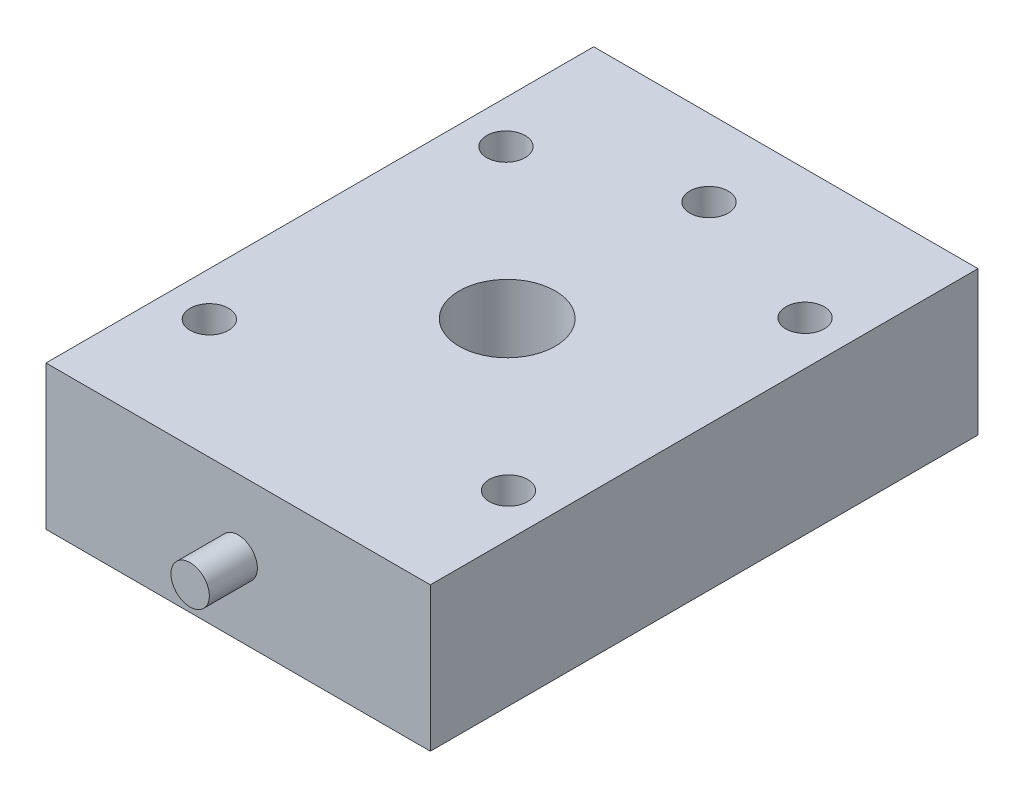
ISO-10303-21;
HEADER;
FILE_DESCRIPTION(('STEP AP214'),'2;1');
FILE_NAME('part.step','',(''),(''),'','','');
FILE_SCHEMA(('AUTOMOTIVE_DESIGN { 1 0 10303 214 1 1 1 1 }'));
ENDSEC;
DATA;
#1=APPLICATION_CONTEXT('core data for automotive mechanical design processes');
#2=APPLICATION_PROTOCOL_DEFINITION('international standard','automotive_design',2000,#1);
#3=PRODUCT_CONTEXT('',#1,'mechanical');
#4=PRODUCT('Part','Part','',(#3));
#5=PRODUCT_RELATED_PRODUCT_CATEGORY('part','',(#4));
#6=PRODUCT_DEFINITION_FORMATION('','',#4);
#7=PRODUCT_DEFINITION_CONTEXT('part definition',#1,'design');
#8=PRODUCT_DEFINITION('design','',#6,#7);
#9=PRODUCT_DEFINITION_SHAPE('','',#8);
#10=(LENGTH_UNIT() NAMED_UNIT(*) SI_UNIT(.MILLI.,.METRE.));
#11=(NAMED_UNIT(*) PLANE_ANGLE_UNIT() SI_UNIT($,.RADIAN.));
#12=(NAMED_UNIT(*) SI_UNIT($,.STERADIAN.) SOLID_ANGLE_UNIT());
#13=UNCERTAINTY_MEASURE_WITH_UNIT(LENGTH_MEASURE(1.E-05),#10,'distance_accuracy_value','');
#14=(GEOMETRIC_REPRESENTATION_CONTEXT(3) GLOBAL_UNCERTAINTY_ASSIGNED_CONTEXT((#13)) GLOBAL_UNIT_ASSIGNED_CONTEXT((#10,
#11,#12)) REPRESENTATION_CONTEXT('',''));
#15=CARTESIAN_POINT('',(0.,0.,0.));
#16=DIRECTION('',(0.,0.,1.));
#17=DIRECTION('',(1.,0.,0.));
#18=AXIS2_PLACEMENT_3D('',#15,#16,#17);
#19=CARTESIAN_POINT('',(20.,-7.5,57.));
#20=DIRECTION('',(-1.,0.,0.));
#21=DIRECTION('',(0.,0.,1.));
#22=AXIS2_PLACEMENT_3D('',#19,#20,#21);
#23=PLANE('',#22);
#24=DIRECTION('',(0.,1.,0.));
#25=VECTOR('',#24,1.);
#26=CARTESIAN_POINT('',(20.,-7.5,0.));
#27=LINE('',#26,#25);
#28=CARTESIAN_POINT('',(20.,-7.5,0.));
#29=VERTEX_POINT('',#28);
#30=CARTESIAN_POINT('',(20.,7.5,0.));
#31=VERTEX_POINT('',#30);
#32=EDGE_CURVE('E104',#29,#31,#27,.T.);
#33=ORIENTED_EDGE('',*,*,#32,.T.);
#34=DIRECTION('',(0.,0.,-1.));
#35=VECTOR('',#34,1.);
#36=CARTESIAN_POINT('',(20.,7.5,57.));
#37=LINE('',#36,#35);
#38=CARTESIAN_POINT('',(20.,7.5,57.));
#39=VERTEX_POINT('',#38);
#40=EDGE_CURVE('E46',#39,#31,#37,.T.);
#41=ORIENTED_EDGE('',*,*,#40,.F.);
#42=DIRECTION('',(0.,1.,0.));
#43=VECTOR('',#42,1.);
#44=CARTESIAN_POINT('',(20.,-7.5,57.));
#45=LINE('',#44,#43);
#46=CARTESIAN_POINT('',(20.,-7.5,57.));
#47=VERTEX_POINT('',#46);
#48=EDGE_CURVE('E90',#47,#39,#45,.T.);
#49=ORIENTED_EDGE('',*,*,#48,.F.);
#50=DIRECTION('',(0.,0.,-1.));
#51=VECTOR('',#50,1.);
#52=CARTESIAN_POINT('',(20.,-7.5,57.));
#53=LINE('',#52,#51);
#54=EDGE_CURVE('E100',#47,#29,#53,.T.);
#55=ORIENTED_EDGE('',*,*,#54,.T.);
#56=EDGE_LOOP('',(#33,#41,#49,#55));
#57=FACE_BOUND('',#56,.T.);
#58=ADVANCED_FACE('F33',(#57),#23,.F.);
#59=CARTESIAN_POINT('',(-20.,7.5,57.));
#60=DIRECTION('',(0.,-1.,0.));
#61=DIRECTION('',(0.,0.,-1.));
#62=AXIS2_PLACEMENT_3D('',#59,#60,#61);
#63=PLANE('',#62);
#64=CARTESIAN_POINT('',(-15.5662559829138,7.5,13.5665404178315));
#65=DIRECTION('',(0.,-1.,0.));
#66=DIRECTION('',(0.,0.,-1.));
#67=AXIS2_PLACEMENT_3D('',#64,#65,#66);
#68=CIRCLE('',#67,2.00000000000257);
#69=CARTESIAN_POINT('',(-15.5662559829138,7.5,11.5665404178289));
#70=VERTEX_POINT('',#69);
#71=EDGE_CURVE('E230',#70,#70,#68,.T.);
#72=ORIENTED_EDGE('',*,*,#71,.T.);
#73=EDGE_LOOP('',(#72));
#74=FACE_BOUND('',#73,.T.);
#75=CARTESIAN_POINT('',(-15.4334595821667,7.5,44.5662559829129));
#76=DIRECTION('',(0.,-1.,0.));
#77=DIRECTION('',(0.,0.,-1.));
#78=AXIS2_PLACEMENT_3D('',#75,#76,#77);
#79=CIRCLE('',#78,2.00000000000063);
#80=CARTESIAN_POINT('',(-15.4334595821667,7.5,42.5662559829123));
#81=VERTEX_POINT('',#80);
#82=EDGE_CURVE('E232',#81,#81,#79,.T.);
#83=ORIENTED_EDGE('',*,*,#82,.T.);
#84=EDGE_LOOP('',(#83));
#85=FACE_BOUND('',#84,.T.);
#86=CARTESIAN_POINT('',(15.5662559829138,7.5,44.4334595821657));
#87=DIRECTION('',(0.,-1.,0.));
#88=DIRECTION('',(0.,0.,-1.));
#89=AXIS2_PLACEMENT_3D('',#86,#87,#88);
#90=CIRCLE('',#89,2.);
#91=CARTESIAN_POINT('',(15.5662559829138,7.5,42.4334595821657));
#92=VERTEX_POINT('',#91);
#93=EDGE_CURVE('E239',#92,#92,#90,.T.);
#94=ORIENTED_EDGE('',*,*,#93,.T.);
#95=EDGE_LOOP('',(#94));
#96=FACE_BOUND('',#95,.T.);
#97=CARTESIAN_POINT('',(15.4334595821684,7.5,13.4337440170843));
#98=DIRECTION('',(0.,-1.,0.));
#99=DIRECTION('',(0.,0.,-1.));
#100=AXIS2_PLACEMENT_3D('',#97,#98,#99);
#101=CIRCLE('',#100,2.00000000000091);
#102=CARTESIAN_POINT('',(15.4334595821684,7.5,11.4337440170834));
#103=VERTEX_POINT('',#102);
#104=EDGE_CURVE('E169',#103,#103,#101,.T.);
#105=ORIENTED_EDGE('',*,*,#104,.T.);
#106=EDGE_LOOP('',(#105));
#107=FACE_BOUND('',#106,.T.);
#108=CARTESIAN_POINT('',(0.,7.5,28.9999999999982));
#109=DIRECTION('',(0.,-1.,0.));
#110=DIRECTION('',(0.,0.,-1.));
#111=AXIS2_PLACEMENT_3D('',#108,#109,#110);
#112=CIRCLE('',#111,5.);
#113=CARTESIAN_POINT('',(0.,7.5,23.9999999999982));
#114=VERTEX_POINT('',#113);
#115=EDGE_CURVE('E168',#114,#114,#112,.T.);
#116=ORIENTED_EDGE('',*,*,#115,.T.);
#117=EDGE_LOOP('',(#116));
#118=FACE_BOUND('',#117,.T.);
#119=CARTESIAN_POINT('',(0.,7.5,8.));
#120=DIRECTION('',(0.,1.,0.));
#121=DIRECTION('',(0.,0.,1.));
#122=AXIS2_PLACEMENT_3D('',#119,#120,#121);
#123=CIRCLE('',#122,2.);
#124=CARTESIAN_POINT('',(0.,7.5,10.));
#125=VERTEX_POINT('',#124);
#126=EDGE_CURVE('E172',#125,#125,#123,.T.);
#127=ORIENTED_EDGE('',*,*,#126,.F.);
#128=EDGE_LOOP('',(#127));
#129=FACE_BOUND('',#128,.T.);
#130=DIRECTION('',(-1.,0.,0.));
#131=VECTOR('',#130,1.);
#132=CARTESIAN_POINT('',(-20.,7.5,0.));
#133=LINE('',#132,#131);
#134=CARTESIAN_POINT('',(-20.,7.5,0.));
#135=VERTEX_POINT('',#134);
#136=EDGE_CURVE('E95',#31,#135,#133,.T.);
#137=ORIENTED_EDGE('',*,*,#136,.T.);
#138=DIRECTION('',(0.,0.,-1.));
#139=VECTOR('',#138,1.);
#140=CARTESIAN_POINT('',(-20.,7.5,57.));
#141=LINE('',#140,#139);
#142=CARTESIAN_POINT('',(-20.,7.5,57.));
#143=VERTEX_POINT('',#142);
#144=EDGE_CURVE('E93',#143,#135,#141,.T.);
#145=ORIENTED_EDGE('',*,*,#144,.F.);
#146=DIRECTION('',(-1.,0.,0.));
#147=VECTOR('',#146,1.);
#148=CARTESIAN_POINT('',(-20.,7.5,57.));
#149=LINE('',#148,#147);
#150=EDGE_CURVE('E85',#39,#143,#149,.T.);
#151=ORIENTED_EDGE('',*,*,#150,.F.);
#152=ORIENTED_EDGE('',*,*,#40,.T.);
#153=EDGE_LOOP('',(#137,#145,#151,#152));
#154=FACE_BOUND('',#153,.T.);
#155=ADVANCED_FACE('F94',(#74,#85,#96,#107,#118,#129,#154),#63,.F.);
#156=CARTESIAN_POINT('',(-20.,-7.5,57.));
#157=DIRECTION('',(1.,0.,0.));
#158=DIRECTION('',(0.,0.,-1.));
#159=AXIS2_PLACEMENT_3D('',#156,#157,#158);
#160=PLANE('',#159);
#161=DIRECTION('',(0.,-1.,0.));
#162=VECTOR('',#161,1.);
#163=CARTESIAN_POINT('',(-20.,-7.5,0.));
#164=LINE('',#163,#162);
#165=CARTESIAN_POINT('',(-20.,-7.5,0.));
#166=VERTEX_POINT('',#165);
#167=EDGE_CURVE('E71',#135,#166,#164,.T.);
#168=ORIENTED_EDGE('',*,*,#167,.T.);
#169=DIRECTION('',(0.,0.,-1.));
#170=VECTOR('',#169,1.);
#171=CARTESIAN_POINT('',(-20.,-7.5,57.));
#172=LINE('',#171,#170);
#173=CARTESIAN_POINT('',(-20.,-7.5,57.));
#174=VERTEX_POINT('',#173);
#175=EDGE_CURVE('E96',#174,#166,#172,.T.);
#176=ORIENTED_EDGE('',*,*,#175,.F.);
#177=DIRECTION('',(0.,-1.,0.));
#178=VECTOR('',#177,1.);
#179=CARTESIAN_POINT('',(-20.,-7.5,57.));
#180=LINE('',#179,#178);
#181=EDGE_CURVE('E88',#143,#174,#180,.T.);
#182=ORIENTED_EDGE('',*,*,#181,.F.);
#183=ORIENTED_EDGE('',*,*,#144,.T.);
#184=EDGE_LOOP('',(#168,#176,#182,#183));
#185=FACE_BOUND('',#184,.T.);
#186=ADVANCED_FACE('F98',(#185),#160,.F.);
#187=CARTESIAN_POINT('',(-20.,-7.5,57.));
#188=DIRECTION('',(0.,1.,0.));
#189=DIRECTION('',(0.,0.,1.));
#190=AXIS2_PLACEMENT_3D('',#187,#188,#189);
#191=PLANE('',#190);
#192=CARTESIAN_POINT('',(-15.5662559829138,-7.5,13.5665404178315));
#193=DIRECTION('',(0.,-1.,0.));
#194=DIRECTION('',(0.,0.,-1.));
#195=AXIS2_PLACEMENT_3D('',#192,#193,#194);
#196=CIRCLE('',#195,2.00000000000257);
#197=CARTESIAN_POINT('',(-15.5662559829138,-7.5,11.5665404178289));
#198=VERTEX_POINT('',#197);
#199=EDGE_CURVE('E151',#198,#198,#196,.T.);
#200=ORIENTED_EDGE('',*,*,#199,.F.);
#201=EDGE_LOOP('',(#200));
#202=FACE_BOUND('',#201,.T.);
#203=CARTESIAN_POINT('',(-15.4334595821667,-7.5,44.5662559829129));
#204=DIRECTION('',(0.,-1.,0.));
#205=DIRECTION('',(0.,0.,-1.));
#206=AXIS2_PLACEMENT_3D('',#203,#204,#205);
#207=CIRCLE('',#206,2.00000000000063);
#208=CARTESIAN_POINT('',(-15.4334595821667,-7.5,42.5662559829123));
#209=VERTEX_POINT('',#208);
#210=EDGE_CURVE('E155',#209,#209,#207,.T.);
#211=ORIENTED_EDGE('',*,*,#210,.F.);
#212=EDGE_LOOP('',(#211));
#213=FACE_BOUND('',#212,.T.);
#214=CARTESIAN_POINT('',(15.5662559829138,-7.5,44.4334595821657));
#215=DIRECTION('',(0.,-1.,0.));
#216=DIRECTION('',(0.,0.,-1.));
#217=AXIS2_PLACEMENT_3D('',#214,#215,#216);
#218=CIRCLE('',#217,2.);
#219=CARTESIAN_POINT('',(15.5662559829138,-7.5,42.4334595821657));
#220=VERTEX_POINT('',#219);
#221=EDGE_CURVE('E159',#220,#220,#218,.T.);
#222=ORIENTED_EDGE('',*,*,#221,.F.);
#223=EDGE_LOOP('',(#222));
#224=FACE_BOUND('',#223,.T.);
#225=CARTESIAN_POINT('',(15.4334595821684,-7.5,13.4337440170843));
#226=DIRECTION('',(0.,-1.,0.));
#227=DIRECTION('',(0.,0.,-1.));
#228=AXIS2_PLACEMENT_3D('',#225,#226,#227);
#229=CIRCLE('',#228,2.00000000000091);
#230=CARTESIAN_POINT('',(15.4334595821684,-7.5,11.4337440170834));
#231=VERTEX_POINT('',#230);
#232=EDGE_CURVE('E163',#231,#231,#229,.T.);
#233=ORIENTED_EDGE('',*,*,#232,.F.);
#234=EDGE_LOOP('',(#233));
#235=FACE_BOUND('',#234,.T.);
#236=CARTESIAN_POINT('',(0.,-7.5,28.9999999999982));
#237=DIRECTION('',(0.,-1.,0.));
#238=DIRECTION('',(0.,0.,-1.));
#239=AXIS2_PLACEMENT_3D('',#236,#237,#238);
#240=CIRCLE('',#239,5.);
#241=CARTESIAN_POINT('',(0.,-7.5,23.9999999999982));
#242=VERTEX_POINT('',#241);
#243=EDGE_CURVE('E166',#242,#242,#240,.T.);
#244=ORIENTED_EDGE('',*,*,#243,.F.);
#245=EDGE_LOOP('',(#244));
#246=FACE_BOUND('',#245,.T.);
#247=DIRECTION('',(1.,0.,0.));
#248=VECTOR('',#247,1.);
#249=CARTESIAN_POINT('',(-20.,-7.5,0.));
#250=LINE('',#249,#248);
#251=EDGE_CURVE('E77',#166,#29,#250,.T.);
#252=ORIENTED_EDGE('',*,*,#251,.T.);
#253=ORIENTED_EDGE('',*,*,#54,.F.);
#254=DIRECTION('',(1.,0.,0.));
#255=VECTOR('',#254,1.);
#256=CARTESIAN_POINT('',(-20.,-7.5,57.));
#257=LINE('',#256,#255);
#258=EDGE_CURVE('E54',#174,#47,#257,.T.);
#259=ORIENTED_EDGE('',*,*,#258,.F.);
#260=ORIENTED_EDGE('',*,*,#175,.T.);
#261=EDGE_LOOP('',(#252,#253,#259,#260));
#262=FACE_BOUND('',#261,.T.);
#263=ADVANCED_FACE('F128',(#202,#213,#224,#235,#246,#262),#191,.F.);
#264=CARTESIAN_POINT('',(0.,0.,57.));
#265=DIRECTION('',(0.,0.,-1.));
#266=DIRECTION('',(-1.,0.,0.));
#267=AXIS2_PLACEMENT_3D('',#264,#265,#266);
#268=PLANE('',#267);
#269=CARTESIAN_POINT('',(0.,0.,57.));
#270=DIRECTION('',(0.,0.,-1.));
#271=DIRECTION('',(-1.,0.,0.));
#272=AXIS2_PLACEMENT_3D('',#269,#270,#271);
#273=CIRCLE('',#272,2.);
#274=CARTESIAN_POINT('',(-2.,0.,57.));
#275=VERTEX_POINT('',#274);
#276=EDGE_CURVE('E11',#275,#275,#273,.F.);
#277=ORIENTED_EDGE('',*,*,#276,.F.);
#278=EDGE_LOOP('',(#277));
#279=FACE_BOUND('',#278,.T.);
#280=ORIENTED_EDGE('',*,*,#48,.T.);
#281=ORIENTED_EDGE('',*,*,#150,.T.);
#282=ORIENTED_EDGE('',*,*,#181,.T.);
#283=ORIENTED_EDGE('',*,*,#258,.T.);
#284=EDGE_LOOP('',(#280,#281,#282,#283));
#285=FACE_BOUND('',#284,.T.);
#286=ADVANCED_FACE('F86',(#279,#285),#268,.F.);
#287=CARTESIAN_POINT('',(0.,0.,0.));
#288=DIRECTION('',(0.,0.,-1.));
#289=DIRECTION('',(-1.,0.,0.));
#290=AXIS2_PLACEMENT_3D('',#287,#288,#289);
#291=PLANE('',#290);
#292=CARTESIAN_POINT('',(0.,0.,0.));
#293=DIRECTION('',(0.,0.,-1.));
#294=DIRECTION('',(-1.,0.,0.));
#295=AXIS2_PLACEMENT_3D('',#292,#293,#294);
#296=CIRCLE('',#295,2.5);
#297=CARTESIAN_POINT('',(-2.5,0.,0.));
#298=VERTEX_POINT('',#297);
#299=EDGE_CURVE('E182',#298,#298,#296,.T.);
#300=ORIENTED_EDGE('',*,*,#299,.F.);
#301=EDGE_LOOP('',(#300));
#302=FACE_BOUND('',#301,.T.);
#303=ORIENTED_EDGE('',*,*,#32,.F.);
#304=ORIENTED_EDGE('',*,*,#251,.F.);
#305=ORIENTED_EDGE('',*,*,#167,.F.);
#306=ORIENTED_EDGE('',*,*,#136,.F.);
#307=EDGE_LOOP('',(#303,#304,#305,#306));
#308=FACE_BOUND('',#307,.T.);
#309=ADVANCED_FACE('F116',(#302,#308),#291,.T.);
#310=CARTESIAN_POINT('',(0.,0.,62.));
#311=DIRECTION('',(0.,0.,-1.));
#312=DIRECTION('',(-1.,0.,0.));
#313=AXIS2_PLACEMENT_3D('',#310,#311,#312);
#314=CYLINDRICAL_SURFACE('',#313,2.);
#315=CARTESIAN_POINT('',(0.,0.,62.));
#316=DIRECTION('',(0.,0.,1.));
#317=DIRECTION('',(1.,0.,0.));
#318=AXIS2_PLACEMENT_3D('',#315,#316,#317);
#319=CIRCLE('',#318,2.);
#320=CARTESIAN_POINT('',(2.,0.,62.));
#321=VERTEX_POINT('',#320);
#322=EDGE_CURVE('E107',#321,#321,#319,.T.);
#323=ORIENTED_EDGE('',*,*,#322,.F.);
#324=EDGE_LOOP('',(#323));
#325=FACE_BOUND('',#324,.T.);
#326=ORIENTED_EDGE('',*,*,#276,.T.);
#327=EDGE_LOOP('',(#326));
#328=FACE_BOUND('',#327,.T.);
#329=ADVANCED_FACE('F118',(#325,#328),#314,.T.);
#330=CARTESIAN_POINT('',(0.,0.,62.));
#331=DIRECTION('',(0.,0.,1.));
#332=DIRECTION('',(1.,0.,0.));
#333=AXIS2_PLACEMENT_3D('',#330,#331,#332);
#334=PLANE('',#333);
#335=ORIENTED_EDGE('',*,*,#322,.T.);
#336=EDGE_LOOP('',(#335));
#337=FACE_BOUND('',#336,.T.);
#338=ADVANCED_FACE('F125',(#337),#334,.T.);
#339=CARTESIAN_POINT('',(0.,0.,23.));
#340=DIRECTION('',(0.,0.,-1.));
#341=DIRECTION('',(-1.,0.,0.));
#342=AXIS2_PLACEMENT_3D('',#339,#340,#341);
#343=CYLINDRICAL_SURFACE('',#342,2.5);
#344=CARTESIAN_POINT('',(0.,2.5,10.));
#345=CARTESIAN_POINT('',(0.0959968964388703,2.49999264947401,9.99999242056707));
#346=CARTESIAN_POINT('',(0.192133192964675,2.49441368411908,9.99303057133644));
#347=CARTESIAN_POINT('',(0.381319365477408,2.47259269360604,9.96565005995827));
#348=CARTESIAN_POINT('',(0.474361934321337,2.45632708000382,9.94520162873807));
#349=CARTESIAN_POINT('',(0.654094916824508,2.4146672181517,9.89232172110493));
#350=CARTESIAN_POINT('',(0.740821698128049,2.38933120144167,9.85996664856862));
#351=CARTESIAN_POINT('',(0.906926323692545,2.33136010996601,9.78488265652266));
#352=CARTESIAN_POINT('',(0.986304144671506,2.29872501207752,9.74215370414941));
#353=CARTESIAN_POINT('',(1.16318123656703,2.21575664728951,9.63137163496894));
#354=CARTESIAN_POINT('',(1.25736767952115,2.16321748603216,9.55968108482594));
#355=CARTESIAN_POINT('',(1.43041367827884,2.05292192603027,9.4027219342605));
#356=CARTESIAN_POINT('',(1.50922761533154,1.99515072200505,9.31741424649663));
#357=CARTESIAN_POINT('',(1.6521591895554,1.87856001629835,9.13322601592733));
#358=CARTESIAN_POINT('',(1.71602638457222,1.81973830902028,9.03415322702388));
#359=CARTESIAN_POINT('',(1.82646834413604,1.7088210988299,8.82346121749581));
#360=CARTESIAN_POINT('',(1.87310099386401,1.65670347089169,8.71188566611201));
#361=CARTESIAN_POINT('',(1.93086043771819,1.58835652300927,8.52612104832302));
#362=CARTESIAN_POINT('',(1.94865475820658,1.56628727770188,8.45618826201971));
#363=CARTESIAN_POINT('',(1.97673396798331,1.53069889155832,8.31278731587953));
#364=CARTESIAN_POINT('',(1.98703731881776,1.5171587417974,8.23932832647501));
#365=CARTESIAN_POINT('',(1.99939840142554,1.50084234061103,8.08980748112896));
#366=CARTESIAN_POINT('',(2.00138345613423,1.49816096926556,8.01372851517921));
#367=CARTESIAN_POINT('',(1.99669481699686,1.50439962302809,7.86229510796726));
#368=CARTESIAN_POINT('',(1.99001379511087,1.51332946660241,7.7869413342337));
#369=CARTESIAN_POINT('',(1.9669530271194,1.5432072129997,7.62777769738727));
#370=CARTESIAN_POINT('',(1.94921808205621,1.56581842049528,7.544491993946));
#371=CARTESIAN_POINT('',(1.90444547348848,1.61997459936279,7.38346444046297));
#372=CARTESIAN_POINT('',(1.87738025642251,1.65154598198641,7.30573984346018));
#373=CARTESIAN_POINT('',(1.79974102194077,1.73656116159416,7.11933789395903));
#374=CARTESIAN_POINT('',(1.74414886595504,1.79313372968153,7.01419730169582));
#375=CARTESIAN_POINT('',(1.61638467497537,1.90913780060687,6.81628332220067));
#376=CARTESIAN_POINT('',(1.54418846902465,1.96857337048937,6.72352827915647));
#377=CARTESIAN_POINT('',(1.38145818326396,2.08612751968448,6.54872522859493));
#378=CARTESIAN_POINT('',(1.29048701026967,2.14416889260779,6.46702807769423));
#379=CARTESIAN_POINT('',(1.09198491072667,2.25171871494994,6.31990050056569));
#380=CARTESIAN_POINT('',(0.984499645201081,2.3012499182245,6.25442648388277));
#381=CARTESIAN_POINT('',(0.787777814380561,2.37424585643318,6.15943715259011));
#382=CARTESIAN_POINT('',(0.702177727329208,2.40111071224171,6.12499549556093));
#383=CARTESIAN_POINT('',(0.524913923737155,2.44597564111417,6.06787354901203));
#384=CARTESIAN_POINT('',(0.433254836272287,2.46398239496913,6.04518439505452));
#385=CARTESIAN_POINT('',(0.24571323384493,2.48970335685206,6.01286145306421));
#386=CARTESIAN_POINT('',(0.149811307212619,2.49736378633666,6.00329587525505));
#387=CARTESIAN_POINT('',(-0.042608002867516,2.50148682701864,5.99814095102371));
#388=CARTESIAN_POINT('',(-0.139125268327961,2.49795152409062,6.00254900117794));
#389=CARTESIAN_POINT('',(-0.321746674155461,2.48076858642945,6.02408281624769));
#390=CARTESIAN_POINT('',(-0.408060891756564,2.46796352405063,6.04014917513901));
#391=CARTESIAN_POINT('',(-0.576335674228719,2.43417513213473,6.08287218110156));
#392=CARTESIAN_POINT('',(-0.658294938856939,2.41318937553439,6.10953197109662));
#393=CARTESIAN_POINT('',(-0.821235877548907,2.36289849431328,6.17415037178393));
#394=CARTESIAN_POINT('',(-0.901843619419052,2.33315912736867,6.21270578595637));
#395=CARTESIAN_POINT('',(-1.05541000448331,2.2678362272214,6.29886215163279));
#396=CARTESIAN_POINT('',(-1.12836826593788,2.23225240258423,6.34646355423455));
#397=CARTESIAN_POINT('',(-1.27925237569143,2.14993687522397,6.45922431829687));
#398=CARTESIAN_POINT('',(-1.35550718978129,2.1023696976822,6.526001690483));
#399=CARTESIAN_POINT('',(-1.4965368759753,2.0044349795202,6.66938696137099));
#400=CARTESIAN_POINT('',(-1.56127777727367,1.95405970991097,6.74602283683883));
#401=CARTESIAN_POINT('',(-1.65568487930787,1.87374135317135,6.87643444323659));
#402=CARTESIAN_POINT('',(-1.68913741792652,1.84354743685463,6.92736059075333));
#403=CARTESIAN_POINT('',(-1.75155001920543,1.78435415521131,7.03262226142359));
#404=CARTESIAN_POINT('',(-1.78050769868975,1.75535542951891,7.08695957188079));
#405=CARTESIAN_POINT('',(-1.83358089959817,1.69983828792997,7.19887484028166));
#406=CARTESIAN_POINT('',(-1.85771431687654,1.67331090774834,7.25643976724369));
#407=CARTESIAN_POINT('',(-1.90088481958635,1.62410209867689,7.37500897850398));
#408=CARTESIAN_POINT('',(-1.9199255893155,1.60141789380427,7.43601073751954));
#409=CARTESIAN_POINT('',(-1.95360165889083,1.5601942022258,7.5660867242378));
#410=CARTESIAN_POINT('',(-1.96779559724999,1.54209716714775,7.63542266494035));
#411=CARTESIAN_POINT('',(-1.98878905619367,1.51493371593791,7.77683761273805));
#412=CARTESIAN_POINT('',(-1.99560723074758,1.50584452307525,7.84890922045048));
#413=CARTESIAN_POINT('',(-2.00132058716546,1.49824736779721,7.99434870546408));
#414=CARTESIAN_POINT('',(-2.00017319779789,1.49979625918437,8.06772145415416));
#415=CARTESIAN_POINT('',(-1.98996519544204,1.51330771695992,8.2129841930231));
#416=CARTESIAN_POINT('',(-1.98089203653787,1.52528679347387,8.2848716473261));
#417=CARTESIAN_POINT('',(-1.95207745752715,1.56207076756083,8.44460677434455));
#418=CARTESIAN_POINT('',(-1.93009230408642,1.5894925841937,8.53142308249112));
#419=CARTESIAN_POINT('',(-1.87608177217432,1.65288907642407,8.69863347868964));
#420=CARTESIAN_POINT('',(-1.84402681542564,1.68888887211293,8.77900776003671));
#421=CARTESIAN_POINT('',(-1.78094746311468,1.75491158724438,8.91217772204615));
#422=CARTESIAN_POINT('',(-1.75202363190409,1.78388907325008,8.96651918151829));
#423=CARTESIAN_POINT('',(-1.68964733782463,1.84307948739002,9.07183822981726));
#424=CARTESIAN_POINT('',(-1.65619322765903,1.87329286211508,9.12281458495115));
#425=CARTESIAN_POINT('',(-1.54918435570711,1.96437997758119,9.27077940329882));
#426=CARTESIAN_POINT('',(-1.4689854164051,2.02569808481402,9.36279868666247));
#427=CARTESIAN_POINT('',(-1.29001718858431,2.14418278787112,9.53338946483076));
#428=CARTESIAN_POINT('',(-1.19101966157649,2.201284919641,9.61177022423679));
#429=CARTESIAN_POINT('',(-1.02998399899547,2.27874650804527,9.71557672941679));
#430=CARTESIAN_POINT('',(-0.9742554001997,2.30318868109328,9.74786844413512));
#431=CARTESIAN_POINT('',(-0.85885482862805,2.34866115465601,9.80736810096138));
#432=CARTESIAN_POINT('',(-0.799185299805368,2.36969354228912,9.83457915448451));
#433=CARTESIAN_POINT('',(-0.655037739424251,2.41420905511499,9.89178005989561));
#434=CARTESIAN_POINT('',(-0.569110239590123,2.43602892887628,9.91948267180093));
#435=CARTESIAN_POINT('',(-0.392713097427725,2.47058864976841,9.96315767338771));
#436=CARTESIAN_POINT('',(-0.302256024103141,2.48335227816872,9.9791607887746));
#437=CARTESIAN_POINT('',(-0.175880930919914,2.49405378309104,9.99256302556031));
#438=CARTESIAN_POINT('',(-0.140808552821274,2.49627918763429,9.99534737874577));
#439=CARTESIAN_POINT('',(-0.0704970748918281,2.499253810179,9.99906746352746));
#440=CARTESIAN_POINT('',(-0.0352579397117337,2.50000269971647,10.0000027837899));
#441=CARTESIAN_POINT('',(0.,2.5,10.));
#442=B_SPLINE_CURVE_WITH_KNOTS('',3,(#344,#345,#346,#347,#348,#349,#350,#351,#352,#353,#354,
#355,#356,#357,#358,#359,#360,#361,#362,#363,#364,#365,#366,#367,#368,#369,#370,#371,#372,#373,
#374,#375,#376,#377,#378,#379,#380,#381,#382,#383,#384,#385,#386,#387,#388,#389,#390,#391,#392,
#393,#394,#395,#396,#397,#398,#399,#400,#401,#402,#403,#404,#405,#406,#407,#408,#409,#410,#411,
#412,#413,#414,#415,#416,#417,#418,#419,#420,#421,#422,#423,#424,#425,#426,#427,#428,#429,#430,
#431,#432,#433,#434,#435,#436,#437,#438,#439,#440,#441),.UNSPECIFIED.,.T.,.F.,(4,2,2,2,2,2,2,2,
2,2,2,2,2,2,2,2,2,2,2,2,2,2,2,2,2,2,2,2,2,2,2,2,2,2,2,2,2,2,2,2,2,2,2,2,2,2,2,2,4),(0.,
0.287836605992209,0.576310692639342,0.862965057250605,1.14962032997081,1.53607888200101,
1.92366738187851,2.31734741765481,2.70969292925127,2.9353448634113,3.1604387740811,
3.38749528500759,3.61474392028823,3.8775863003201,4.14121163495705,4.534257481883,
4.92787915886674,5.33198173288419,5.73498644040676,6.02213978124802,6.30907621738868,
6.59749843639964,6.88586692268771,7.15087004938159,7.41595185759572,7.69742753051566,
7.97891724351349,8.31365537249325,8.64936529970902,8.85316560745906,9.0570736038085,
9.26021055202078,9.46320013996581,9.68152133432596,9.89928907450684,10.1182215471168,
10.3375012031536,10.616933053181,10.8971934831173,11.1010640012511,11.3050088506911,
11.7129165318148,12.1261363563906,12.3324811048119,12.5386990694968,12.8161540735934,
13.0928777702216,13.1985714874516,13.3042887145431),.UNSPECIFIED.);
#443=CARTESIAN_POINT('',(0.,2.5,10.));
#444=VERTEX_POINT('',#443);
#445=EDGE_CURVE('E36',#444,#444,#442,.T.);
#446=ORIENTED_EDGE('',*,*,#445,.T.);
#447=EDGE_LOOP('',(#446));
#448=FACE_BOUND('',#447,.T.);
#449=CARTESIAN_POINT('',(0.,0.,23.));
#450=DIRECTION('',(0.,0.,-1.));
#451=DIRECTION('',(-1.,0.,0.));
#452=AXIS2_PLACEMENT_3D('',#449,#450,#451);
#453=CIRCLE('',#452,2.5);
#454=CARTESIAN_POINT('',(-2.5,0.,23.));
#455=VERTEX_POINT('',#454);
#456=EDGE_CURVE('E179',#455,#455,#453,.T.);
#457=ORIENTED_EDGE('',*,*,#456,.F.);
#458=EDGE_LOOP('',(#457));
#459=FACE_BOUND('',#458,.T.);
#460=ORIENTED_EDGE('',*,*,#299,.T.);
#461=EDGE_LOOP('',(#460));
#462=FACE_BOUND('',#461,.T.);
#463=ADVANCED_FACE('F191',(#448,#459,#462),#343,.F.);
#464=CARTESIAN_POINT('',(0.,0.,23.));
#465=DIRECTION('',(0.,0.,-1.));
#466=DIRECTION('',(-1.,0.,0.));
#467=AXIS2_PLACEMENT_3D('',#464,#465,#466);
#468=PLANE('',#467);
#469=ORIENTED_EDGE('',*,*,#456,.T.);
#470=EDGE_LOOP('',(#469));
#471=FACE_BOUND('',#470,.T.);
#472=ADVANCED_FACE('F196',(#471),#468,.T.);
#473=CARTESIAN_POINT('',(0.,-0.5,8.));
#474=DIRECTION('',(0.,1.,0.));
#475=DIRECTION('',(0.,0.,1.));
#476=AXIS2_PLACEMENT_3D('',#473,#474,#475);
#477=CYLINDRICAL_SURFACE('',#476,2.);
#478=ORIENTED_EDGE('',*,*,#126,.T.);
#479=EDGE_LOOP('',(#478));
#480=FACE_BOUND('',#479,.T.);
#481=ORIENTED_EDGE('',*,*,#445,.F.);
#482=EDGE_LOOP('',(#481));
#483=FACE_BOUND('',#482,.T.);
#484=ADVANCED_FACE('F201',(#480,#483),#477,.F.);
#485=CARTESIAN_POINT('',(0.,7.5,28.9999999999982));
#486=DIRECTION('',(0.,-1.,0.));
#487=DIRECTION('',(0.,0.,-1.));
#488=AXIS2_PLACEMENT_3D('',#485,#486,#487);
#489=CYLINDRICAL_SURFACE('',#488,5.);
#490=CARTESIAN_POINT('',(0.,7.5,23.9999999999982));
#491=CARTESIAN_POINT('',(0.,7.34375,23.9999999999982));
#492=CARTESIAN_POINT('',(0.,7.1875,23.9999999999982));
#493=CARTESIAN_POINT('',(0.,6.875,23.9999999999982));
#494=CARTESIAN_POINT('',(0.,6.71875,23.9999999999982));
#495=CARTESIAN_POINT('',(0.,6.40625,23.9999999999982));
#496=CARTESIAN_POINT('',(0.,6.25,23.9999999999982));
#497=CARTESIAN_POINT('',(0.,5.9375,23.9999999999982));
#498=CARTESIAN_POINT('',(0.,5.78125,23.9999999999982));
#499=CARTESIAN_POINT('',(0.,5.46875,23.9999999999982));
#500=CARTESIAN_POINT('',(0.,5.3125,23.9999999999982));
#501=CARTESIAN_POINT('',(0.,5.,23.9999999999982));
#502=CARTESIAN_POINT('',(0.,4.84375,23.9999999999982));
#503=CARTESIAN_POINT('',(0.,4.53125,23.9999999999982));
#504=CARTESIAN_POINT('',(0.,4.375,23.9999999999982));
#505=CARTESIAN_POINT('',(0.,4.0625,23.9999999999982));
#506=CARTESIAN_POINT('',(0.,3.90625,23.9999999999982));
#507=CARTESIAN_POINT('',(0.,3.59375,23.9999999999982));
#508=CARTESIAN_POINT('',(0.,3.4375,23.9999999999982));
#509=CARTESIAN_POINT('',(0.,3.125,23.9999999999982));
#510=CARTESIAN_POINT('',(0.,2.96875,23.9999999999982));
#511=CARTESIAN_POINT('',(0.,2.65625,23.9999999999982));
#512=CARTESIAN_POINT('',(0.,2.5,23.9999999999982));
#513=CARTESIAN_POINT('',(0.,2.1875,23.9999999999982));
#514=CARTESIAN_POINT('',(0.,2.03125,23.9999999999982));
#515=CARTESIAN_POINT('',(0.,1.71875,23.9999999999982));
#516=CARTESIAN_POINT('',(0.,1.5625,23.9999999999982));
#517=CARTESIAN_POINT('',(0.,1.25,23.9999999999982));
#518=CARTESIAN_POINT('',(0.,1.09375,23.9999999999982));
#519=CARTESIAN_POINT('',(0.,0.781250000000001,23.9999999999982));
#520=CARTESIAN_POINT('',(0.,0.625000000000001,23.9999999999982));
#521=CARTESIAN_POINT('',(0.,0.312500000000001,23.9999999999982));
#522=CARTESIAN_POINT('',(0.,0.156250000000001,23.9999999999982));
#523=CARTESIAN_POINT('',(0.,-0.156249999999999,23.9999999999982));
#524=CARTESIAN_POINT('',(0.,-0.312499999999999,23.9999999999982));
#525=CARTESIAN_POINT('',(0.,-0.624999999999999,23.9999999999982));
#526=CARTESIAN_POINT('',(0.,-0.781249999999999,23.9999999999982));
#527=CARTESIAN_POINT('',(0.,-1.09375,23.9999999999982));
#528=CARTESIAN_POINT('',(0.,-1.25,23.9999999999982));
#529=CARTESIAN_POINT('',(0.,-1.5625,23.9999999999982));
#530=CARTESIAN_POINT('',(0.,-1.71875,23.9999999999982));
#531=CARTESIAN_POINT('',(0.,-2.03125,23.9999999999982));
#532=CARTESIAN_POINT('',(0.,-2.1875,23.9999999999982));
#533=CARTESIAN_POINT('',(0.,-2.5,23.9999999999982));
#534=CARTESIAN_POINT('',(0.,-2.65625,23.9999999999982));
#535=CARTESIAN_POINT('',(0.,-2.96875,23.9999999999982));
#536=CARTESIAN_POINT('',(0.,-3.125,23.9999999999982));
#537=CARTESIAN_POINT('',(0.,-3.4375,23.9999999999982));
#538=CARTESIAN_POINT('',(0.,-3.59375,23.9999999999982));
#539=CARTESIAN_POINT('',(0.,-3.90625,23.9999999999982));
#540=CARTESIAN_POINT('',(0.,-4.0625,23.9999999999982));
#541=CARTESIAN_POINT('',(0.,-4.375,23.9999999999982));
#542=CARTESIAN_POINT('',(0.,-4.53125,23.9999999999982));
#543=CARTESIAN_POINT('',(0.,-4.84375,23.9999999999982));
#544=CARTESIAN_POINT('',(0.,-5.,23.9999999999982));
#545=CARTESIAN_POINT('',(0.,-5.3125,23.9999999999982));
#546=CARTESIAN_POINT('',(0.,-5.46875,23.9999999999982));
#547=CARTESIAN_POINT('',(0.,-5.78125,23.9999999999982));
#548=CARTESIAN_POINT('',(0.,-5.9375,23.9999999999982));
#549=CARTESIAN_POINT('',(0.,-6.25,23.9999999999982));
#550=CARTESIAN_POINT('',(0.,-6.40625,23.9999999999982));
#551=CARTESIAN_POINT('',(0.,-6.71875,23.9999999999982));
#552=CARTESIAN_POINT('',(0.,-6.875,23.9999999999982));
#553=CARTESIAN_POINT('',(0.,-7.1875,23.9999999999982));
#554=CARTESIAN_POINT('',(0.,-7.34375,23.9999999999982));
#555=CARTESIAN_POINT('',(0.,-7.5,23.9999999999982));
#556=B_SPLINE_CURVE_WITH_KNOTS('',3,(#490,#491,#492,#493,#494,#495,#496,#497,#498,#499,#500,
#501,#502,#503,#504,#505,#506,#507,#508,#509,#510,#511,#512,#513,#514,#515,#516,#517,#518,#519,
#520,#521,#522,#523,#524,#525,#526,#527,#528,#529,#530,#531,#532,#533,#534,#535,#536,#537,#538,
#539,#540,#541,#542,#543,#544,#545,#546,#547,#548,#549,#550,#551,#552,#553,#554,#555),
.UNSPECIFIED.,.F.,.F.,(4,2,2,2,2,2,2,2,2,2,2,2,2,2,2,2,2,2,2,2,2,2,2,2,2,2,2,2,2,2,2,2,4),(0.,
0.46875,0.937499999999999,1.40625,1.875,2.34375,2.8125,3.28125,3.75,4.21875,4.6875,5.15625,
5.625,6.09375,6.5625,7.03125,7.5,7.96875,8.4375,8.90625,9.375,9.84375,10.3125,10.78125,11.25,
11.71875,12.1875,12.65625,13.125,13.59375,14.0625,14.53125,15.),.UNSPECIFIED.);
#557=EDGE_CURVE('BSEAM206',#114,#242,#556,.T.);
#558=ORIENTED_EDGE('',*,*,#115,.F.);
#559=ORIENTED_EDGE('',*,*,#243,.T.);
#560=ORIENTED_EDGE('',*,*,#557,.T.);
#561=ORIENTED_EDGE('',*,*,#557,.F.);
#562=EDGE_LOOP('',(#558,#560,#559,#561));
#563=FACE_BOUND('',#562,.T.);
#564=ADVANCED_FACE('F206',(#563),#489,.F.);
#565=CARTESIAN_POINT('',(15.4334595821684,21.5,13.4337440170843));
#566=DIRECTION('',(0.,-1.,0.));
#567=DIRECTION('',(0.,0.,-1.));
#568=AXIS2_PLACEMENT_3D('',#565,#566,#567);
#569=CYLINDRICAL_SURFACE('',#568,2.00000000000091);
#570=ORIENTED_EDGE('',*,*,#232,.T.);
#571=EDGE_LOOP('',(#570));
#572=FACE_BOUND('',#571,.T.);
#573=ORIENTED_EDGE('',*,*,#104,.F.);
#574=EDGE_LOOP('',(#573));
#575=FACE_BOUND('',#574,.T.);
#576=ADVANCED_FACE('F210',(#572,#575),#569,.F.);
#577=CARTESIAN_POINT('',(15.5662559829138,21.5,44.4334595821657));
#578=DIRECTION('',(0.,-1.,0.));
#579=DIRECTION('',(0.,0.,-1.));
#580=AXIS2_PLACEMENT_3D('',#577,#578,#579);
#581=CYLINDRICAL_SURFACE('',#580,2.);
#582=ORIENTED_EDGE('',*,*,#221,.T.);
#583=EDGE_LOOP('',(#582));
#584=FACE_BOUND('',#583,.T.);
#585=ORIENTED_EDGE('',*,*,#93,.F.);
#586=EDGE_LOOP('',(#585));
#587=FACE_BOUND('',#586,.T.);
#588=ADVANCED_FACE('F214',(#584,#587),#581,.F.);
#589=CARTESIAN_POINT('',(-15.4334595821667,21.5,44.5662559829129));
#590=DIRECTION('',(0.,-1.,0.));
#591=DIRECTION('',(0.,0.,-1.));
#592=AXIS2_PLACEMENT_3D('',#589,#590,#591);
#593=CYLINDRICAL_SURFACE('',#592,2.00000000000063);
#594=ORIENTED_EDGE('',*,*,#210,.T.);
#595=EDGE_LOOP('',(#594));
#596=FACE_BOUND('',#595,.T.);
#597=ORIENTED_EDGE('',*,*,#82,.F.);
#598=EDGE_LOOP('',(#597));
#599=FACE_BOUND('',#598,.T.);
#600=ADVANCED_FACE('F218',(#596,#599),#593,.F.);
#601=CARTESIAN_POINT('',(-15.5662559829138,21.5,13.5665404178315));
#602=DIRECTION('',(0.,-1.,0.));
#603=DIRECTION('',(0.,0.,-1.));
#604=AXIS2_PLACEMENT_3D('',#601,#602,#603);
#605=CYLINDRICAL_SURFACE('',#604,2.00000000000257);
#606=ORIENTED_EDGE('',*,*,#199,.T.);
#607=EDGE_LOOP('',(#606));
#608=FACE_BOUND('',#607,.T.);
#609=ORIENTED_EDGE('',*,*,#71,.F.);
#610=EDGE_LOOP('',(#609));
#611=FACE_BOUND('',#610,.T.);
#612=ADVANCED_FACE('F222',(#608,#611),#605,.F.);
#613=CLOSED_SHELL('',(#58,#155,#186,#263,#286,#309,#329,#338,#463,#472,#484,#564,#576,#588,#600,#612));
#614=MANIFOLD_SOLID_BREP('B2',#613);
#615=ADVANCED_BREP_SHAPE_REPRESENTATION('',(#18,#614),#14);
#616=SHAPE_DEFINITION_REPRESENTATION(#9,#615);
ENDSEC;
END-ISO-10303-21;
